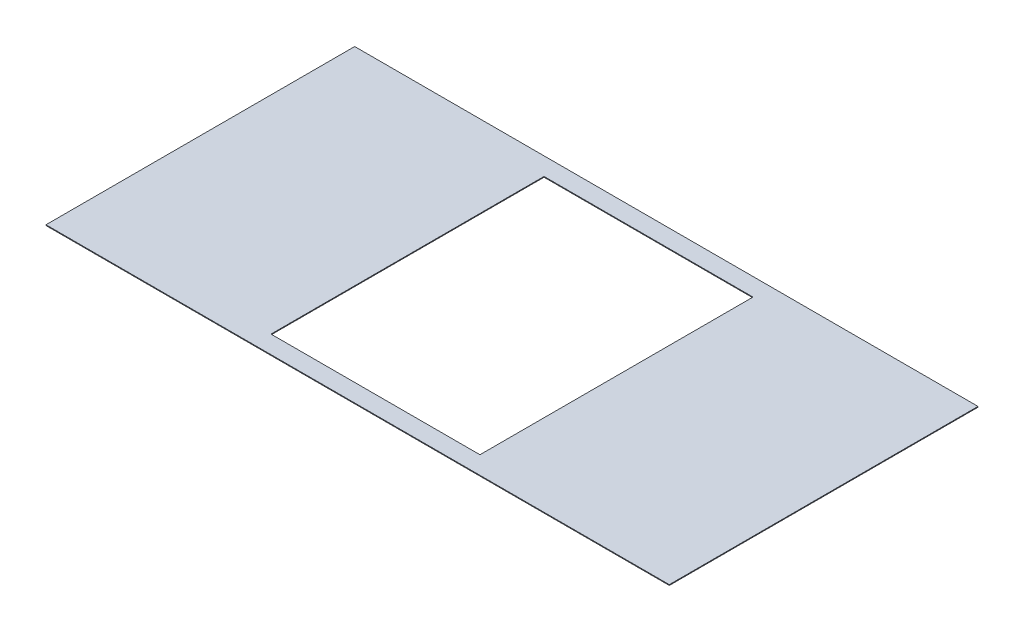
ISO-10303-21;
HEADER;
FILE_DESCRIPTION(('STEP AP214'),'2;1');
FILE_NAME('part.step','',(''),(''),'','','');
FILE_SCHEMA(('AUTOMOTIVE_DESIGN { 1 0 10303 214 1 1 1 1 }'));
ENDSEC;
DATA;
#1=APPLICATION_CONTEXT('core data for automotive mechanical design processes');
#2=APPLICATION_PROTOCOL_DEFINITION('international standard','automotive_design',2000,#1);
#3=PRODUCT_CONTEXT('',#1,'mechanical');
#4=PRODUCT('Part','Part','',(#3));
#5=PRODUCT_RELATED_PRODUCT_CATEGORY('part','',(#4));
#6=PRODUCT_DEFINITION_FORMATION('','',#4);
#7=PRODUCT_DEFINITION_CONTEXT('part definition',#1,'design');
#8=PRODUCT_DEFINITION('design','',#6,#7);
#9=PRODUCT_DEFINITION_SHAPE('','',#8);
#10=(LENGTH_UNIT() NAMED_UNIT(*) SI_UNIT(.MILLI.,.METRE.));
#11=(NAMED_UNIT(*) PLANE_ANGLE_UNIT() SI_UNIT($,.RADIAN.));
#12=(NAMED_UNIT(*) SI_UNIT($,.STERADIAN.) SOLID_ANGLE_UNIT());
#13=UNCERTAINTY_MEASURE_WITH_UNIT(LENGTH_MEASURE(1.E-05),#10,'distance_accuracy_value','');
#14=(GEOMETRIC_REPRESENTATION_CONTEXT(3) GLOBAL_UNCERTAINTY_ASSIGNED_CONTEXT((#13)) GLOBAL_UNIT_ASSIGNED_CONTEXT((#10,
#11,#12)) REPRESENTATION_CONTEXT('',''));
#15=CARTESIAN_POINT('',(0.,0.,0.));
#16=DIRECTION('',(0.,0.,1.));
#17=DIRECTION('',(1.,0.,0.));
#18=AXIS2_PLACEMENT_3D('',#15,#16,#17);
#19=CARTESIAN_POINT('',(525.,1.25,-260.));
#20=DIRECTION('',(-1.,0.,0.));
#21=DIRECTION('',(0.,0.,1.));
#22=AXIS2_PLACEMENT_3D('',#19,#20,#21);
#23=PLANE('',#22);
#24=DIRECTION('',(0.,0.,-1.));
#25=VECTOR('',#24,1.);
#26=CARTESIAN_POINT('',(525.,0.,-260.));
#27=LINE('',#26,#25);
#28=CARTESIAN_POINT('',(525.,0.,260.));
#29=VERTEX_POINT('',#28);
#30=CARTESIAN_POINT('',(525.,0.,-260.));
#31=VERTEX_POINT('',#30);
#32=EDGE_CURVE('E146',#29,#31,#27,.T.);
#33=ORIENTED_EDGE('',*,*,#32,.T.);
#34=DIRECTION('',(0.,-1.,0.));
#35=VECTOR('',#34,1.);
#36=CARTESIAN_POINT('',(525.,1.25,-260.));
#37=LINE('',#36,#35);
#38=CARTESIAN_POINT('',(525.,1.25,-260.));
#39=VERTEX_POINT('',#38);
#40=EDGE_CURVE('E11',#39,#31,#37,.T.);
#41=ORIENTED_EDGE('',*,*,#40,.F.);
#42=DIRECTION('',(0.,0.,-1.));
#43=VECTOR('',#42,1.);
#44=CARTESIAN_POINT('',(525.,1.25,-260.));
#45=LINE('',#44,#43);
#46=CARTESIAN_POINT('',(525.,1.25,260.));
#47=VERTEX_POINT('',#46);
#48=EDGE_CURVE('E152',#47,#39,#45,.T.);
#49=ORIENTED_EDGE('',*,*,#48,.F.);
#50=DIRECTION('',(0.,-1.,0.));
#51=VECTOR('',#50,1.);
#52=CARTESIAN_POINT('',(525.,1.25,260.));
#53=LINE('',#52,#51);
#54=EDGE_CURVE('E166',#47,#29,#53,.T.);
#55=ORIENTED_EDGE('',*,*,#54,.T.);
#56=EDGE_LOOP('',(#33,#41,#49,#55));
#57=FACE_BOUND('',#56,.T.);
#58=ADVANCED_FACE('F38',(#57),#23,.F.);
#59=CARTESIAN_POINT('',(-525.,1.25,-260.));
#60=DIRECTION('',(0.,0.,1.));
#61=DIRECTION('',(1.,0.,0.));
#62=AXIS2_PLACEMENT_3D('',#59,#60,#61);
#63=PLANE('',#62);
#64=DIRECTION('',(-1.,0.,0.));
#65=VECTOR('',#64,1.);
#66=CARTESIAN_POINT('',(-525.,0.,-260.));
#67=LINE('',#66,#65);
#68=CARTESIAN_POINT('',(-525.,0.,-260.));
#69=VERTEX_POINT('',#68);
#70=EDGE_CURVE('E170',#31,#69,#67,.T.);
#71=ORIENTED_EDGE('',*,*,#70,.T.);
#72=DIRECTION('',(0.,-1.,0.));
#73=VECTOR('',#72,1.);
#74=CARTESIAN_POINT('',(-525.,1.25,-260.));
#75=LINE('',#74,#73);
#76=CARTESIAN_POINT('',(-525.,1.25,-260.));
#77=VERTEX_POINT('',#76);
#78=EDGE_CURVE('E46',#77,#69,#75,.T.);
#79=ORIENTED_EDGE('',*,*,#78,.F.);
#80=DIRECTION('',(-1.,0.,0.));
#81=VECTOR('',#80,1.);
#82=CARTESIAN_POINT('',(-525.,1.25,-260.));
#83=LINE('',#82,#81);
#84=EDGE_CURVE('E156',#39,#77,#83,.T.);
#85=ORIENTED_EDGE('',*,*,#84,.F.);
#86=ORIENTED_EDGE('',*,*,#40,.T.);
#87=EDGE_LOOP('',(#71,#79,#85,#86));
#88=FACE_BOUND('',#87,.T.);
#89=ADVANCED_FACE('F204',(#88),#63,.F.);
#90=CARTESIAN_POINT('',(-525.,1.25,-260.));
#91=DIRECTION('',(1.,0.,0.));
#92=DIRECTION('',(0.,0.,-1.));
#93=AXIS2_PLACEMENT_3D('',#90,#91,#92);
#94=PLANE('',#93);
#95=DIRECTION('',(0.,0.,1.));
#96=VECTOR('',#95,1.);
#97=CARTESIAN_POINT('',(-525.,0.,-260.));
#98=LINE('',#97,#96);
#99=CARTESIAN_POINT('',(-525.,0.,260.));
#100=VERTEX_POINT('',#99);
#101=EDGE_CURVE('E173',#69,#100,#98,.T.);
#102=ORIENTED_EDGE('',*,*,#101,.T.);
#103=DIRECTION('',(0.,-1.,0.));
#104=VECTOR('',#103,1.);
#105=CARTESIAN_POINT('',(-525.,1.25,260.));
#106=LINE('',#105,#104);
#107=CARTESIAN_POINT('',(-525.,1.25,260.));
#108=VERTEX_POINT('',#107);
#109=EDGE_CURVE('E181',#108,#100,#106,.T.);
#110=ORIENTED_EDGE('',*,*,#109,.F.);
#111=DIRECTION('',(0.,0.,1.));
#112=VECTOR('',#111,1.);
#113=CARTESIAN_POINT('',(-525.,1.25,-260.));
#114=LINE('',#113,#112);
#115=EDGE_CURVE('E160',#77,#108,#114,.T.);
#116=ORIENTED_EDGE('',*,*,#115,.F.);
#117=ORIENTED_EDGE('',*,*,#78,.T.);
#118=EDGE_LOOP('',(#102,#110,#116,#117));
#119=FACE_BOUND('',#118,.T.);
#120=ADVANCED_FACE('F190',(#119),#94,.F.);
#121=CARTESIAN_POINT('',(-525.,1.25,260.));
#122=DIRECTION('',(0.,0.,-1.));
#123=DIRECTION('',(-1.,0.,0.));
#124=AXIS2_PLACEMENT_3D('',#121,#122,#123);
#125=PLANE('',#124);
#126=DIRECTION('',(1.,0.,0.));
#127=VECTOR('',#126,1.);
#128=CARTESIAN_POINT('',(-525.,0.,260.));
#129=LINE('',#128,#127);
#130=EDGE_CURVE('E157',#100,#29,#129,.T.);
#131=ORIENTED_EDGE('',*,*,#130,.T.);
#132=ORIENTED_EDGE('',*,*,#54,.F.);
#133=DIRECTION('',(1.,0.,0.));
#134=VECTOR('',#133,1.);
#135=CARTESIAN_POINT('',(-525.,1.25,260.));
#136=LINE('',#135,#134);
#137=EDGE_CURVE('E163',#108,#47,#136,.T.);
#138=ORIENTED_EDGE('',*,*,#137,.F.);
#139=ORIENTED_EDGE('',*,*,#109,.T.);
#140=EDGE_LOOP('',(#131,#132,#138,#139));
#141=FACE_BOUND('',#140,.T.);
#142=ADVANCED_FACE('F197',(#141),#125,.F.);
#143=CARTESIAN_POINT('',(0.,1.25,0.));
#144=DIRECTION('',(0.,1.,0.));
#145=DIRECTION('',(0.,0.,1.));
#146=AXIS2_PLACEMENT_3D('',#143,#144,#145);
#147=PLANE('',#146);
#148=DIRECTION('',(0.,0.,-1.));
#149=VECTOR('',#148,1.);
#150=CARTESIAN_POINT('',(176.,1.25,-230.));
#151=LINE('',#150,#149);
#152=CARTESIAN_POINT('',(176.,1.25,230.));
#153=VERTEX_POINT('',#152);
#154=CARTESIAN_POINT('',(176.,1.25,-230.));
#155=VERTEX_POINT('',#154);
#156=EDGE_CURVE('E53',#153,#155,#151,.T.);
#157=ORIENTED_EDGE('',*,*,#156,.F.);
#158=DIRECTION('',(1.,0.,0.));
#159=VECTOR('',#158,1.);
#160=CARTESIAN_POINT('',(-176.,1.25,230.));
#161=LINE('',#160,#159);
#162=CARTESIAN_POINT('',(-176.,1.25,230.));
#163=VERTEX_POINT('',#162);
#164=EDGE_CURVE('E124',#163,#153,#161,.T.);
#165=ORIENTED_EDGE('',*,*,#164,.F.);
#166=DIRECTION('',(0.,0.,1.));
#167=VECTOR('',#166,1.);
#168=CARTESIAN_POINT('',(-176.,1.25,-230.));
#169=LINE('',#168,#167);
#170=CARTESIAN_POINT('',(-176.,1.25,-230.));
#171=VERTEX_POINT('',#170);
#172=EDGE_CURVE('E128',#171,#163,#169,.T.);
#173=ORIENTED_EDGE('',*,*,#172,.F.);
#174=DIRECTION('',(-1.,0.,0.));
#175=VECTOR('',#174,1.);
#176=CARTESIAN_POINT('',(-176.,1.25,-230.));
#177=LINE('',#176,#175);
#178=EDGE_CURVE('E137',#155,#171,#177,.T.);
#179=ORIENTED_EDGE('',*,*,#178,.F.);
#180=EDGE_LOOP('',(#157,#165,#173,#179));
#181=FACE_BOUND('',#180,.T.);
#182=ORIENTED_EDGE('',*,*,#48,.T.);
#183=ORIENTED_EDGE('',*,*,#84,.T.);
#184=ORIENTED_EDGE('',*,*,#115,.T.);
#185=ORIENTED_EDGE('',*,*,#137,.T.);
#186=EDGE_LOOP('',(#182,#183,#184,#185));
#187=FACE_BOUND('',#186,.T.);
#188=ADVANCED_FACE('F203',(#181,#187),#147,.T.);
#189=CARTESIAN_POINT('',(0.,0.,0.));
#190=DIRECTION('',(0.,1.,0.));
#191=DIRECTION('',(0.,0.,1.));
#192=AXIS2_PLACEMENT_3D('',#189,#190,#191);
#193=PLANE('',#192);
#194=DIRECTION('',(1.,0.,0.));
#195=VECTOR('',#194,1.);
#196=CARTESIAN_POINT('',(-176.,0.,230.));
#197=LINE('',#196,#195);
#198=CARTESIAN_POINT('',(-176.,0.,230.));
#199=VERTEX_POINT('',#198);
#200=CARTESIAN_POINT('',(176.,0.,230.));
#201=VERTEX_POINT('',#200);
#202=EDGE_CURVE('E112',#199,#201,#197,.T.);
#203=ORIENTED_EDGE('',*,*,#202,.T.);
#204=DIRECTION('',(0.,0.,-1.));
#205=VECTOR('',#204,1.);
#206=CARTESIAN_POINT('',(176.,0.,-230.));
#207=LINE('',#206,#205);
#208=CARTESIAN_POINT('',(176.,0.,-230.));
#209=VERTEX_POINT('',#208);
#210=EDGE_CURVE('E105',#201,#209,#207,.T.);
#211=ORIENTED_EDGE('',*,*,#210,.T.);
#212=DIRECTION('',(-1.,0.,0.));
#213=VECTOR('',#212,1.);
#214=CARTESIAN_POINT('',(-176.,0.,-230.));
#215=LINE('',#214,#213);
#216=CARTESIAN_POINT('',(-176.,0.,-230.));
#217=VERTEX_POINT('',#216);
#218=EDGE_CURVE('E115',#209,#217,#215,.T.);
#219=ORIENTED_EDGE('',*,*,#218,.T.);
#220=DIRECTION('',(0.,0.,1.));
#221=VECTOR('',#220,1.);
#222=CARTESIAN_POINT('',(-176.,0.,-230.));
#223=LINE('',#222,#221);
#224=EDGE_CURVE('E61',#217,#199,#223,.T.);
#225=ORIENTED_EDGE('',*,*,#224,.T.);
#226=EDGE_LOOP('',(#203,#211,#219,#225));
#227=FACE_BOUND('',#226,.T.);
#228=ORIENTED_EDGE('',*,*,#32,.F.);
#229=ORIENTED_EDGE('',*,*,#130,.F.);
#230=ORIENTED_EDGE('',*,*,#101,.F.);
#231=ORIENTED_EDGE('',*,*,#70,.F.);
#232=EDGE_LOOP('',(#228,#229,#230,#231));
#233=FACE_BOUND('',#232,.T.);
#234=ADVANCED_FACE('F120',(#227,#233),#193,.F.);
#235=CARTESIAN_POINT('',(176.,0.,-230.));
#236=DIRECTION('',(1.,0.,0.));
#237=DIRECTION('',(0.,0.,-1.));
#238=AXIS2_PLACEMENT_3D('',#235,#236,#237);
#239=PLANE('',#238);
#240=ORIENTED_EDGE('',*,*,#156,.T.);
#241=DIRECTION('',(0.,1.,0.));
#242=VECTOR('',#241,1.);
#243=CARTESIAN_POINT('',(176.,0.,-230.));
#244=LINE('',#243,#242);
#245=EDGE_CURVE('E101',#209,#155,#244,.T.);
#246=ORIENTED_EDGE('',*,*,#245,.F.);
#247=ORIENTED_EDGE('',*,*,#210,.F.);
#248=DIRECTION('',(0.,1.,0.));
#249=VECTOR('',#248,1.);
#250=CARTESIAN_POINT('',(176.,0.,230.));
#251=LINE('',#250,#249);
#252=EDGE_CURVE('E143',#201,#153,#251,.T.);
#253=ORIENTED_EDGE('',*,*,#252,.T.);
#254=EDGE_LOOP('',(#240,#246,#247,#253));
#255=FACE_BOUND('',#254,.T.);
#256=ADVANCED_FACE('F103',(#255),#239,.F.);
#257=CARTESIAN_POINT('',(-176.,0.,230.));
#258=DIRECTION('',(0.,0.,1.));
#259=DIRECTION('',(1.,0.,0.));
#260=AXIS2_PLACEMENT_3D('',#257,#258,#259);
#261=PLANE('',#260);
#262=ORIENTED_EDGE('',*,*,#164,.T.);
#263=ORIENTED_EDGE('',*,*,#252,.F.);
#264=ORIENTED_EDGE('',*,*,#202,.F.);
#265=DIRECTION('',(0.,1.,0.));
#266=VECTOR('',#265,1.);
#267=CARTESIAN_POINT('',(-176.,0.,230.));
#268=LINE('',#267,#266);
#269=EDGE_CURVE('E147',#199,#163,#268,.T.);
#270=ORIENTED_EDGE('',*,*,#269,.T.);
#271=EDGE_LOOP('',(#262,#263,#264,#270));
#272=FACE_BOUND('',#271,.T.);
#273=ADVANCED_FACE('F221',(#272),#261,.F.);
#274=CARTESIAN_POINT('',(-176.,0.,-230.));
#275=DIRECTION('',(-1.,0.,0.));
#276=DIRECTION('',(0.,0.,1.));
#277=AXIS2_PLACEMENT_3D('',#274,#275,#276);
#278=PLANE('',#277);
#279=ORIENTED_EDGE('',*,*,#172,.T.);
#280=ORIENTED_EDGE('',*,*,#269,.F.);
#281=ORIENTED_EDGE('',*,*,#224,.F.);
#282=DIRECTION('',(0.,1.,0.));
#283=VECTOR('',#282,1.);
#284=CARTESIAN_POINT('',(-176.,0.,-230.));
#285=LINE('',#284,#283);
#286=EDGE_CURVE('E111',#217,#171,#285,.T.);
#287=ORIENTED_EDGE('',*,*,#286,.T.);
#288=EDGE_LOOP('',(#279,#280,#281,#287));
#289=FACE_BOUND('',#288,.T.);
#290=ADVANCED_FACE('F224',(#289),#278,.F.);
#291=CARTESIAN_POINT('',(-176.,0.,-230.));
#292=DIRECTION('',(0.,0.,-1.));
#293=DIRECTION('',(-1.,0.,0.));
#294=AXIS2_PLACEMENT_3D('',#291,#292,#293);
#295=PLANE('',#294);
#296=ORIENTED_EDGE('',*,*,#178,.T.);
#297=ORIENTED_EDGE('',*,*,#286,.F.);
#298=ORIENTED_EDGE('',*,*,#218,.F.);
#299=ORIENTED_EDGE('',*,*,#245,.T.);
#300=EDGE_LOOP('',(#296,#297,#298,#299));
#301=FACE_BOUND('',#300,.T.);
#302=ADVANCED_FACE('F116',(#301),#295,.F.);
#303=CLOSED_SHELL('',(#58,#89,#120,#142,#188,#234,#256,#273,#290,#302));
#304=MANIFOLD_SOLID_BREP('B2',#303);
#305=ADVANCED_BREP_SHAPE_REPRESENTATION('',(#18,#304),#14);
#306=SHAPE_DEFINITION_REPRESENTATION(#9,#305);
ENDSEC;
END-ISO-10303-21;
